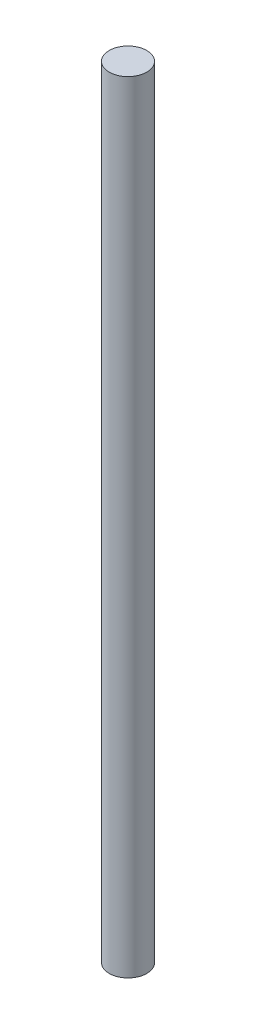
ISO-10303-21;
HEADER;
FILE_DESCRIPTION(('STEP AP214'),'2;1');
FILE_NAME('part.step','',(''),(''),'','','');
FILE_SCHEMA(('AUTOMOTIVE_DESIGN { 1 0 10303 214 1 1 1 1 }'));
ENDSEC;
DATA;
#1=APPLICATION_CONTEXT('core data for automotive mechanical design processes');
#2=APPLICATION_PROTOCOL_DEFINITION('international standard','automotive_design',2000,#1);
#3=PRODUCT_CONTEXT('',#1,'mechanical');
#4=PRODUCT('Part','Part','',(#3));
#5=PRODUCT_RELATED_PRODUCT_CATEGORY('part','',(#4));
#6=PRODUCT_DEFINITION_FORMATION('','',#4);
#7=PRODUCT_DEFINITION_CONTEXT('part definition',#1,'design');
#8=PRODUCT_DEFINITION('design','',#6,#7);
#9=PRODUCT_DEFINITION_SHAPE('','',#8);
#10=(LENGTH_UNIT() NAMED_UNIT(*) SI_UNIT(.MILLI.,.METRE.));
#11=(NAMED_UNIT(*) PLANE_ANGLE_UNIT() SI_UNIT($,.RADIAN.));
#12=(NAMED_UNIT(*) SI_UNIT($,.STERADIAN.) SOLID_ANGLE_UNIT());
#13=UNCERTAINTY_MEASURE_WITH_UNIT(LENGTH_MEASURE(1.E-05),#10,'distance_accuracy_value','');
#14=(GEOMETRIC_REPRESENTATION_CONTEXT(3) GLOBAL_UNCERTAINTY_ASSIGNED_CONTEXT((#13)) GLOBAL_UNIT_ASSIGNED_CONTEXT((#10,
#11,#12)) REPRESENTATION_CONTEXT('',''));
#15=CARTESIAN_POINT('',(0.,0.,0.));
#16=DIRECTION('',(0.,0.,1.));
#17=DIRECTION('',(1.,0.,0.));
#18=AXIS2_PLACEMENT_3D('',#15,#16,#17);
#19=CARTESIAN_POINT('',(0.,104.,0.));
#20=DIRECTION('',(0.,-1.,0.));
#21=DIRECTION('',(0.,0.,-1.));
#22=AXIS2_PLACEMENT_3D('',#19,#20,#21);
#23=CYLINDRICAL_SURFACE('',#22,2.5);
#24=CARTESIAN_POINT('',(0.,104.,0.));
#25=DIRECTION('',(0.,1.,0.));
#26=DIRECTION('',(0.,0.,1.));
#27=AXIS2_PLACEMENT_3D('',#24,#25,#26);
#28=CIRCLE('',#27,2.5);
#29=CARTESIAN_POINT('',(0.,104.,-2.5));
#30=VERTEX_POINT('',#29);
#31=EDGE_CURVE('E10',#30,#30,#28,.T.);
#32=CARTESIAN_POINT('',(0.,0.,0.));
#33=DIRECTION('',(0.,1.,0.));
#34=DIRECTION('',(0.,0.,1.));
#35=AXIS2_PLACEMENT_3D('',#32,#33,#34);
#36=CIRCLE('',#35,2.5);
#37=CARTESIAN_POINT('',(0.,0.,-2.5));
#38=VERTEX_POINT('',#37);
#39=EDGE_CURVE('E48',#38,#38,#36,.T.);
#40=CARTESIAN_POINT('',(0.,104.,-2.5));
#41=CARTESIAN_POINT('',(0.,102.916666666667,-2.5));
#42=CARTESIAN_POINT('',(0.,101.833333333333,-2.5));
#43=CARTESIAN_POINT('',(0.,99.6666666666667,-2.5));
#44=CARTESIAN_POINT('',(0.,98.5833333333333,-2.5));
#45=CARTESIAN_POINT('',(0.,96.4166666666667,-2.5));
#46=CARTESIAN_POINT('',(0.,95.3333333333333,-2.5));
#47=CARTESIAN_POINT('',(0.,93.1666666666667,-2.5));
#48=CARTESIAN_POINT('',(0.,92.0833333333333,-2.5));
#49=CARTESIAN_POINT('',(0.,89.9166666666667,-2.5));
#50=CARTESIAN_POINT('',(0.,88.8333333333333,-2.5));
#51=CARTESIAN_POINT('',(0.,86.6666666666667,-2.5));
#52=CARTESIAN_POINT('',(0.,85.5833333333333,-2.5));
#53=CARTESIAN_POINT('',(0.,83.4166666666667,-2.5));
#54=CARTESIAN_POINT('',(0.,82.3333333333333,-2.5));
#55=CARTESIAN_POINT('',(0.,80.1666666666666,-2.5));
#56=CARTESIAN_POINT('',(0.,79.0833333333333,-2.5));
#57=CARTESIAN_POINT('',(0.,76.9166666666667,-2.5));
#58=CARTESIAN_POINT('',(0.,75.8333333333333,-2.5));
#59=CARTESIAN_POINT('',(0.,73.6666666666667,-2.5));
#60=CARTESIAN_POINT('',(0.,72.5833333333333,-2.5));
#61=CARTESIAN_POINT('',(0.,70.4166666666667,-2.5));
#62=CARTESIAN_POINT('',(0.,69.3333333333333,-2.5));
#63=CARTESIAN_POINT('',(0.,67.1666666666667,-2.5));
#64=CARTESIAN_POINT('',(0.,66.0833333333333,-2.5));
#65=CARTESIAN_POINT('',(0.,63.9166666666667,-2.5));
#66=CARTESIAN_POINT('',(0.,62.8333333333333,-2.5));
#67=CARTESIAN_POINT('',(0.,60.6666666666667,-2.5));
#68=CARTESIAN_POINT('',(0.,59.5833333333333,-2.5));
#69=CARTESIAN_POINT('',(0.,57.4166666666667,-2.5));
#70=CARTESIAN_POINT('',(0.,56.3333333333333,-2.5));
#71=CARTESIAN_POINT('',(0.,54.1666666666667,-2.5));
#72=CARTESIAN_POINT('',(0.,53.0833333333333,-2.5));
#73=CARTESIAN_POINT('',(0.,50.9166666666667,-2.5));
#74=CARTESIAN_POINT('',(0.,49.8333333333333,-2.5));
#75=CARTESIAN_POINT('',(0.,47.6666666666667,-2.5));
#76=CARTESIAN_POINT('',(0.,46.5833333333333,-2.5));
#77=CARTESIAN_POINT('',(0.,44.4166666666667,-2.5));
#78=CARTESIAN_POINT('',(0.,43.3333333333333,-2.5));
#79=CARTESIAN_POINT('',(0.,41.1666666666667,-2.5));
#80=CARTESIAN_POINT('',(0.,40.0833333333333,-2.5));
#81=CARTESIAN_POINT('',(0.,37.9166666666667,-2.5));
#82=CARTESIAN_POINT('',(0.,36.8333333333333,-2.5));
#83=CARTESIAN_POINT('',(0.,34.6666666666667,-2.5));
#84=CARTESIAN_POINT('',(0.,33.5833333333333,-2.5));
#85=CARTESIAN_POINT('',(0.,31.4166666666667,-2.5));
#86=CARTESIAN_POINT('',(0.,30.3333333333333,-2.5));
#87=CARTESIAN_POINT('',(0.,28.1666666666667,-2.5));
#88=CARTESIAN_POINT('',(0.,27.0833333333333,-2.5));
#89=CARTESIAN_POINT('',(0.,24.9166666666667,-2.5));
#90=CARTESIAN_POINT('',(0.,23.8333333333333,-2.5));
#91=CARTESIAN_POINT('',(0.,21.6666666666667,-2.5));
#92=CARTESIAN_POINT('',(0.,20.5833333333333,-2.5));
#93=CARTESIAN_POINT('',(0.,18.4166666666667,-2.5));
#94=CARTESIAN_POINT('',(0.,17.3333333333333,-2.5));
#95=CARTESIAN_POINT('',(0.,15.1666666666667,-2.5));
#96=CARTESIAN_POINT('',(0.,14.0833333333333,-2.5));
#97=CARTESIAN_POINT('',(0.,11.9166666666667,-2.5));
#98=CARTESIAN_POINT('',(0.,10.8333333333333,-2.5));
#99=CARTESIAN_POINT('',(0.,8.66666666666666,-2.5));
#100=CARTESIAN_POINT('',(0.,7.58333333333333,-2.5));
#101=CARTESIAN_POINT('',(0.,5.41666666666667,-2.5));
#102=CARTESIAN_POINT('',(0.,4.33333333333334,-2.5));
#103=CARTESIAN_POINT('',(0.,2.16666666666667,-2.5));
#104=CARTESIAN_POINT('',(0.,1.08333333333333,-2.5));
#105=CARTESIAN_POINT('',(0.,0.,-2.5));
#106=B_SPLINE_CURVE_WITH_KNOTS('',3,(#40,#41,#42,#43,#44,#45,#46,#47,#48,#49,#50,#51,#52,#53,
#54,#55,#56,#57,#58,#59,#60,#61,#62,#63,#64,#65,#66,#67,#68,#69,#70,#71,#72,#73,#74,#75,#76,#77,
#78,#79,#80,#81,#82,#83,#84,#85,#86,#87,#88,#89,#90,#91,#92,#93,#94,#95,#96,#97,#98,#99,#100,
#101,#102,#103,#104,#105),.UNSPECIFIED.,.F.,.F.,(4,2,2,2,2,2,2,2,2,2,2,2,2,2,2,2,2,2,2,2,2,2,2,
2,2,2,2,2,2,2,2,2,4),(0.,3.24999999999999,6.49999999999999,9.74999999999999,13.,16.25,19.5,
22.75,26.,29.25,32.5,35.75,39.,42.25,45.5,48.75,52.,55.25,58.5,61.75,65.,68.25,71.5,74.75,78.,
81.25,84.5,87.75,91.,94.25,97.5,100.75,104.),.UNSPECIFIED.);
#107=EDGE_CURVE('BSEAM45',#30,#38,#106,.T.);
#108=ORIENTED_EDGE('',*,*,#31,.F.);
#109=ORIENTED_EDGE('',*,*,#39,.T.);
#110=ORIENTED_EDGE('',*,*,#107,.T.);
#111=ORIENTED_EDGE('',*,*,#107,.F.);
#112=EDGE_LOOP('',(#108,#110,#109,#111));
#113=FACE_BOUND('',#112,.T.);
#114=ADVANCED_FACE('F45',(#113),#23,.T.);
#115=CARTESIAN_POINT('',(0.,104.,0.));
#116=DIRECTION('',(0.,1.,0.));
#117=DIRECTION('',(0.,0.,1.));
#118=AXIS2_PLACEMENT_3D('',#115,#116,#117);
#119=PLANE('',#118);
#120=ORIENTED_EDGE('',*,*,#31,.T.);
#121=EDGE_LOOP('',(#120));
#122=FACE_BOUND('',#121,.T.);
#123=ADVANCED_FACE('F62',(#122),#119,.T.);
#124=CARTESIAN_POINT('',(0.,0.,0.));
#125=DIRECTION('',(0.,1.,0.));
#126=DIRECTION('',(0.,0.,1.));
#127=AXIS2_PLACEMENT_3D('',#124,#125,#126);
#128=PLANE('',#127);
#129=ORIENTED_EDGE('',*,*,#39,.F.);
#130=EDGE_LOOP('',(#129));
#131=FACE_BOUND('',#130,.T.);
#132=ADVANCED_FACE('F60',(#131),#128,.F.);
#133=CLOSED_SHELL('',(#114,#123,#132));
#134=MANIFOLD_SOLID_BREP('B2',#133);
#135=ADVANCED_BREP_SHAPE_REPRESENTATION('',(#18,#134),#14);
#136=SHAPE_DEFINITION_REPRESENTATION(#9,#135);
ENDSEC;
END-ISO-10303-21;
